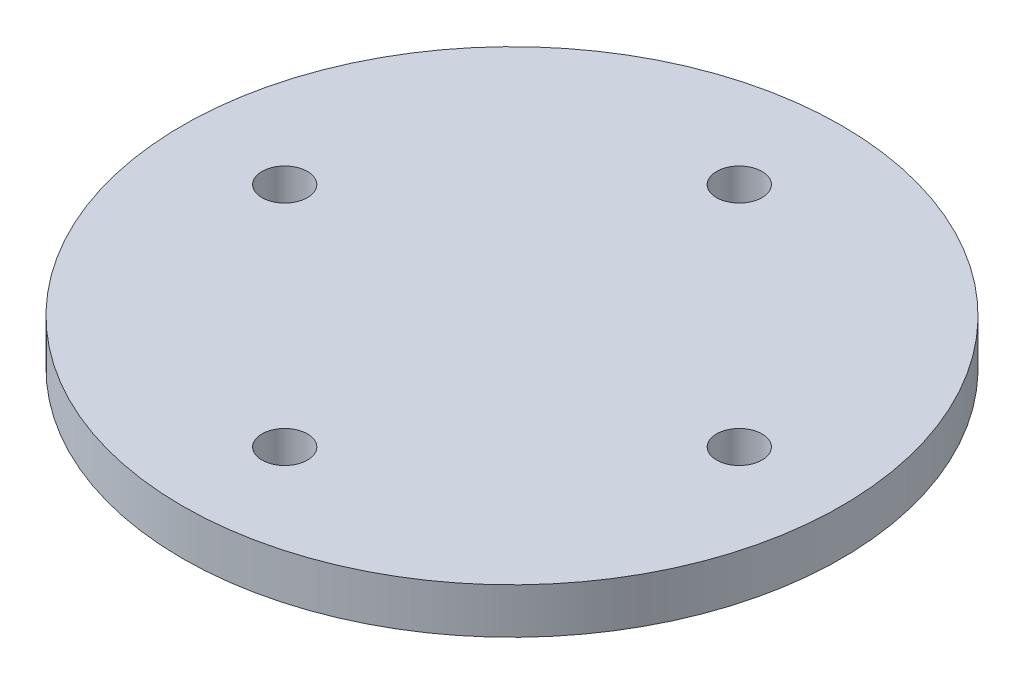
ISO-10303-21;
HEADER;
FILE_DESCRIPTION(('STEP AP214'),'2;1');
FILE_NAME('part.step','',(''),(''),'','','');
FILE_SCHEMA(('AUTOMOTIVE_DESIGN { 1 0 10303 214 1 1 1 1 }'));
ENDSEC;
DATA;
#1=APPLICATION_CONTEXT('core data for automotive mechanical design processes');
#2=APPLICATION_PROTOCOL_DEFINITION('international standard','automotive_design',2000,#1);
#3=PRODUCT_CONTEXT('',#1,'mechanical');
#4=PRODUCT('Part','Part','',(#3));
#5=PRODUCT_RELATED_PRODUCT_CATEGORY('part','',(#4));
#6=PRODUCT_DEFINITION_FORMATION('','',#4);
#7=PRODUCT_DEFINITION_CONTEXT('part definition',#1,'design');
#8=PRODUCT_DEFINITION('design','',#6,#7);
#9=PRODUCT_DEFINITION_SHAPE('','',#8);
#10=(LENGTH_UNIT() NAMED_UNIT(*) SI_UNIT(.MILLI.,.METRE.));
#11=(NAMED_UNIT(*) PLANE_ANGLE_UNIT() SI_UNIT($,.RADIAN.));
#12=(NAMED_UNIT(*) SI_UNIT($,.STERADIAN.) SOLID_ANGLE_UNIT());
#13=UNCERTAINTY_MEASURE_WITH_UNIT(LENGTH_MEASURE(1.E-05),#10,'distance_accuracy_value','');
#14=(GEOMETRIC_REPRESENTATION_CONTEXT(3) GLOBAL_UNCERTAINTY_ASSIGNED_CONTEXT((#13)) GLOBAL_UNIT_ASSIGNED_CONTEXT((#10,
#11,#12)) REPRESENTATION_CONTEXT('',''));
#15=CARTESIAN_POINT('',(0.,0.,0.));
#16=DIRECTION('',(0.,0.,1.));
#17=DIRECTION('',(1.,0.,0.));
#18=AXIS2_PLACEMENT_3D('',#15,#16,#17);
#19=CARTESIAN_POINT('',(0.,2.,0.));
#20=DIRECTION('',(0.,-1.,0.));
#21=DIRECTION('',(0.,0.,-1.));
#22=AXIS2_PLACEMENT_3D('',#19,#20,#21);
#23=CYLINDRICAL_SURFACE('',#22,14.5);
#24=CARTESIAN_POINT('',(0.,2.,0.));
#25=DIRECTION('',(0.,1.,0.));
#26=DIRECTION('',(0.,0.,1.));
#27=AXIS2_PLACEMENT_3D('',#24,#25,#26);
#28=CIRCLE('',#27,14.5);
#29=CARTESIAN_POINT('',(0.,2.,14.5));
#30=VERTEX_POINT('',#29);
#31=EDGE_CURVE('E10',#30,#30,#28,.T.);
#32=ORIENTED_EDGE('',*,*,#31,.F.);
#33=EDGE_LOOP('',(#32));
#34=FACE_BOUND('',#33,.T.);
#35=CARTESIAN_POINT('',(0.,0.,0.));
#36=DIRECTION('',(0.,1.,0.));
#37=DIRECTION('',(0.,0.,1.));
#38=AXIS2_PLACEMENT_3D('',#35,#36,#37);
#39=CIRCLE('',#38,14.5);
#40=CARTESIAN_POINT('',(0.,0.,14.5));
#41=VERTEX_POINT('',#40);
#42=EDGE_CURVE('E42',#41,#41,#39,.T.);
#43=ORIENTED_EDGE('',*,*,#42,.T.);
#44=EDGE_LOOP('',(#43));
#45=FACE_BOUND('',#44,.T.);
#46=ADVANCED_FACE('F40',(#34,#45),#23,.T.);
#47=CARTESIAN_POINT('',(0.,2.,0.));
#48=DIRECTION('',(0.,1.,0.));
#49=DIRECTION('',(0.,0.,1.));
#50=AXIS2_PLACEMENT_3D('',#47,#48,#49);
#51=PLANE('',#50);
#52=CARTESIAN_POINT('',(0.,2.,-10.));
#53=DIRECTION('',(0.,1.,0.));
#54=DIRECTION('',(0.,0.,1.));
#55=AXIS2_PLACEMENT_3D('',#52,#53,#54);
#56=CIRCLE('',#55,0.999999999999995);
#57=CARTESIAN_POINT('',(0.,2.,-9.00000000000001));
#58=VERTEX_POINT('',#57);
#59=EDGE_CURVE('E70',#58,#58,#56,.T.);
#60=ORIENTED_EDGE('',*,*,#59,.F.);
#61=EDGE_LOOP('',(#60));
#62=FACE_BOUND('',#61,.T.);
#63=CARTESIAN_POINT('',(10.,2.,0.));
#64=DIRECTION('',(0.,1.,0.));
#65=DIRECTION('',(0.,0.,1.));
#66=AXIS2_PLACEMENT_3D('',#63,#64,#65);
#67=CIRCLE('',#66,0.999999999999996);
#68=CARTESIAN_POINT('',(10.,2.,1.00000000000003));
#69=VERTEX_POINT('',#68);
#70=EDGE_CURVE('E58',#69,#69,#67,.T.);
#71=ORIENTED_EDGE('',*,*,#70,.F.);
#72=EDGE_LOOP('',(#71));
#73=FACE_BOUND('',#72,.T.);
#74=CARTESIAN_POINT('',(0.,2.,10.));
#75=DIRECTION('',(0.,1.,0.));
#76=DIRECTION('',(0.,0.,1.));
#77=AXIS2_PLACEMENT_3D('',#74,#75,#76);
#78=CIRCLE('',#77,0.999999999999995);
#79=CARTESIAN_POINT('',(0.,2.,11.));
#80=VERTEX_POINT('',#79);
#81=EDGE_CURVE('E60',#80,#80,#78,.T.);
#82=ORIENTED_EDGE('',*,*,#81,.F.);
#83=EDGE_LOOP('',(#82));
#84=FACE_BOUND('',#83,.T.);
#85=CARTESIAN_POINT('',(-10.,2.,-1.04744440165294E-13));
#86=DIRECTION('',(0.,1.,0.));
#87=DIRECTION('',(0.,0.,1.));
#88=AXIS2_PLACEMENT_3D('',#85,#86,#87);
#89=CIRCLE('',#88,0.999999999999994);
#90=CARTESIAN_POINT('',(-10.,2.,0.999999999999889));
#91=VERTEX_POINT('',#90);
#92=EDGE_CURVE('E57',#91,#91,#89,.T.);
#93=ORIENTED_EDGE('',*,*,#92,.F.);
#94=EDGE_LOOP('',(#93));
#95=FACE_BOUND('',#94,.T.);
#96=ORIENTED_EDGE('',*,*,#31,.T.);
#97=EDGE_LOOP('',(#96));
#98=FACE_BOUND('',#97,.T.);
#99=ADVANCED_FACE('F95',(#62,#73,#84,#95,#98),#51,.T.);
#100=CARTESIAN_POINT('',(0.,0.,0.));
#101=DIRECTION('',(0.,1.,0.));
#102=DIRECTION('',(0.,0.,1.));
#103=AXIS2_PLACEMENT_3D('',#100,#101,#102);
#104=PLANE('',#103);
#105=CARTESIAN_POINT('',(0.,0.,-10.));
#106=DIRECTION('',(0.,1.,0.));
#107=DIRECTION('',(0.,0.,1.));
#108=AXIS2_PLACEMENT_3D('',#105,#106,#107);
#109=CIRCLE('',#108,0.999999999999992);
#110=CARTESIAN_POINT('',(0.,0.,-9.00000000000001));
#111=VERTEX_POINT('',#110);
#112=EDGE_CURVE('E37',#111,#111,#109,.T.);
#113=ORIENTED_EDGE('',*,*,#112,.T.);
#114=EDGE_LOOP('',(#113));
#115=FACE_BOUND('',#114,.T.);
#116=CARTESIAN_POINT('',(10.,0.,0.));
#117=DIRECTION('',(0.,1.,0.));
#118=DIRECTION('',(0.,0.,1.));
#119=AXIS2_PLACEMENT_3D('',#116,#117,#118);
#120=CIRCLE('',#119,0.999999999999992);
#121=CARTESIAN_POINT('',(10.,0.,1.00000000000003));
#122=VERTEX_POINT('',#121);
#123=EDGE_CURVE('E59',#122,#122,#120,.T.);
#124=ORIENTED_EDGE('',*,*,#123,.T.);
#125=EDGE_LOOP('',(#124));
#126=FACE_BOUND('',#125,.T.);
#127=CARTESIAN_POINT('',(0.,0.,10.));
#128=DIRECTION('',(0.,1.,0.));
#129=DIRECTION('',(0.,0.,1.));
#130=AXIS2_PLACEMENT_3D('',#127,#128,#129);
#131=CIRCLE('',#130,0.999999999999992);
#132=CARTESIAN_POINT('',(0.,0.,11.));
#133=VERTEX_POINT('',#132);
#134=EDGE_CURVE('E53',#133,#133,#131,.T.);
#135=ORIENTED_EDGE('',*,*,#134,.T.);
#136=EDGE_LOOP('',(#135));
#137=FACE_BOUND('',#136,.T.);
#138=CARTESIAN_POINT('',(-10.,0.,-1.04744440165294E-13));
#139=DIRECTION('',(0.,1.,0.));
#140=DIRECTION('',(0.,0.,1.));
#141=AXIS2_PLACEMENT_3D('',#138,#139,#140);
#142=CIRCLE('',#141,0.999999999999992);
#143=CARTESIAN_POINT('',(-10.,0.,0.999999999999888));
#144=VERTEX_POINT('',#143);
#145=EDGE_CURVE('E47',#144,#144,#142,.T.);
#146=ORIENTED_EDGE('',*,*,#145,.T.);
#147=EDGE_LOOP('',(#146));
#148=FACE_BOUND('',#147,.T.);
#149=ORIENTED_EDGE('',*,*,#42,.F.);
#150=EDGE_LOOP('',(#149));
#151=FACE_BOUND('',#150,.T.);
#152=ADVANCED_FACE('F76',(#115,#126,#137,#148,#151),#104,.F.);
#153=CARTESIAN_POINT('',(-10.,2.,-1.04744440165294E-13));
#154=DIRECTION('',(0.,1.,0.));
#155=DIRECTION('',(0.,0.,1.));
#156=AXIS2_PLACEMENT_3D('',#153,#154,#155);
#157=CYLINDRICAL_SURFACE('',#156,0.999999999999992);
#158=ORIENTED_EDGE('',*,*,#92,.T.);
#159=EDGE_LOOP('',(#158));
#160=FACE_BOUND('',#159,.T.);
#161=ORIENTED_EDGE('',*,*,#145,.F.);
#162=EDGE_LOOP('',(#161));
#163=FACE_BOUND('',#162,.T.);
#164=ADVANCED_FACE('F81',(#160,#163),#157,.F.);
#165=CARTESIAN_POINT('',(0.,2.,10.));
#166=DIRECTION('',(0.,1.,0.));
#167=DIRECTION('',(0.,0.,1.));
#168=AXIS2_PLACEMENT_3D('',#165,#166,#167);
#169=CYLINDRICAL_SURFACE('',#168,0.999999999999992);
#170=ORIENTED_EDGE('',*,*,#81,.T.);
#171=EDGE_LOOP('',(#170));
#172=FACE_BOUND('',#171,.T.);
#173=ORIENTED_EDGE('',*,*,#134,.F.);
#174=EDGE_LOOP('',(#173));
#175=FACE_BOUND('',#174,.T.);
#176=ADVANCED_FACE('F84',(#172,#175),#169,.F.);
#177=CARTESIAN_POINT('',(10.,2.,0.));
#178=DIRECTION('',(0.,1.,0.));
#179=DIRECTION('',(0.,0.,1.));
#180=AXIS2_PLACEMENT_3D('',#177,#178,#179);
#181=CYLINDRICAL_SURFACE('',#180,0.999999999999992);
#182=ORIENTED_EDGE('',*,*,#70,.T.);
#183=EDGE_LOOP('',(#182));
#184=FACE_BOUND('',#183,.T.);
#185=ORIENTED_EDGE('',*,*,#123,.F.);
#186=EDGE_LOOP('',(#185));
#187=FACE_BOUND('',#186,.T.);
#188=ADVANCED_FACE('F90',(#184,#187),#181,.F.);
#189=CARTESIAN_POINT('',(0.,2.,-10.));
#190=DIRECTION('',(0.,1.,0.));
#191=DIRECTION('',(0.,0.,1.));
#192=AXIS2_PLACEMENT_3D('',#189,#190,#191);
#193=CYLINDRICAL_SURFACE('',#192,0.999999999999992);
#194=ORIENTED_EDGE('',*,*,#59,.T.);
#195=EDGE_LOOP('',(#194));
#196=FACE_BOUND('',#195,.T.);
#197=ORIENTED_EDGE('',*,*,#112,.F.);
#198=EDGE_LOOP('',(#197));
#199=FACE_BOUND('',#198,.T.);
#200=ADVANCED_FACE('F113',(#196,#199),#193,.F.);
#201=CLOSED_SHELL('',(#46,#99,#152,#164,#176,#188,#200));
#202=MANIFOLD_SOLID_BREP('B2',#201);
#203=ADVANCED_BREP_SHAPE_REPRESENTATION('',(#18,#202),#14);
#204=SHAPE_DEFINITION_REPRESENTATION(#9,#203);
ENDSEC;
END-ISO-10303-21;
